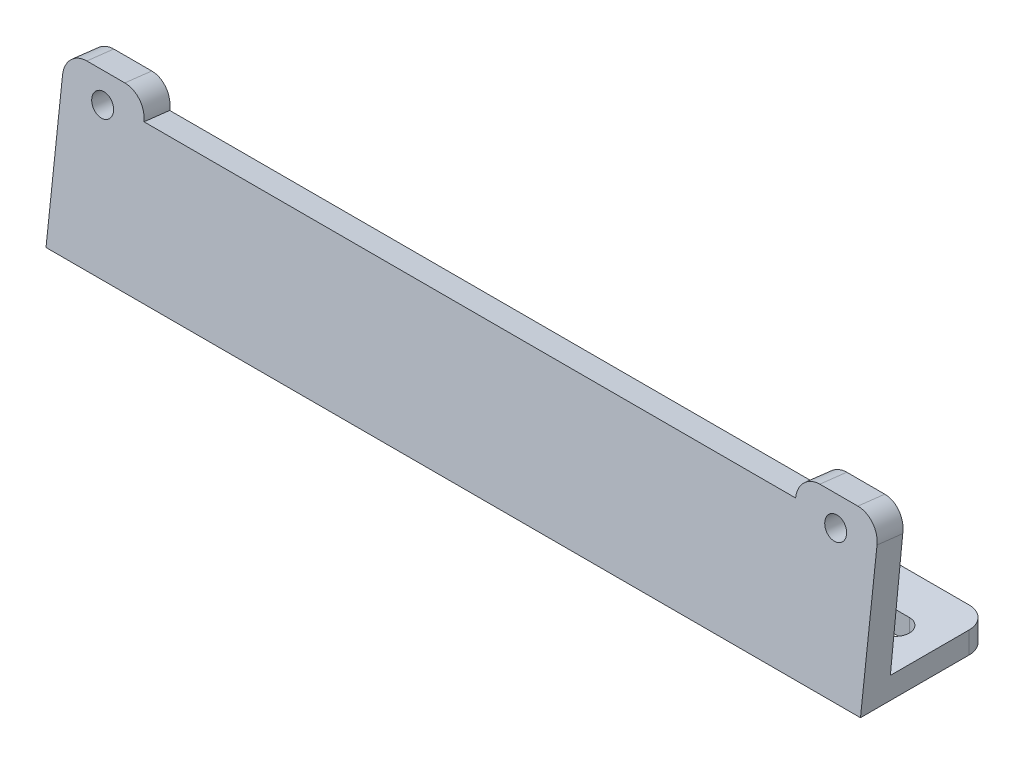
ISO-10303-21;
HEADER;
FILE_DESCRIPTION(('STEP AP214'),'2;1');
FILE_NAME('part.step','',(''),(''),'','','');
FILE_SCHEMA(('AUTOMOTIVE_DESIGN { 1 0 10303 214 1 1 1 1 }'));
ENDSEC;
DATA;
#1=APPLICATION_CONTEXT('core data for automotive mechanical design processes');
#2=APPLICATION_PROTOCOL_DEFINITION('international standard','automotive_design',2000,#1);
#3=PRODUCT_CONTEXT('',#1,'mechanical');
#4=PRODUCT('Part','Part','',(#3));
#5=PRODUCT_RELATED_PRODUCT_CATEGORY('part','',(#4));
#6=PRODUCT_DEFINITION_FORMATION('','',#4);
#7=PRODUCT_DEFINITION_CONTEXT('part definition',#1,'design');
#8=PRODUCT_DEFINITION('design','',#6,#7);
#9=PRODUCT_DEFINITION_SHAPE('','',#8);
#10=(LENGTH_UNIT() NAMED_UNIT(*) SI_UNIT(.MILLI.,.METRE.));
#11=(NAMED_UNIT(*) PLANE_ANGLE_UNIT() SI_UNIT($,.RADIAN.));
#12=(NAMED_UNIT(*) SI_UNIT($,.STERADIAN.) SOLID_ANGLE_UNIT());
#13=UNCERTAINTY_MEASURE_WITH_UNIT(LENGTH_MEASURE(1.E-05),#10,'distance_accuracy_value','');
#14=(GEOMETRIC_REPRESENTATION_CONTEXT(3) GLOBAL_UNCERTAINTY_ASSIGNED_CONTEXT((#13)) GLOBAL_UNIT_ASSIGNED_CONTEXT((#10,
#11,#12)) REPRESENTATION_CONTEXT('',''));
#15=CARTESIAN_POINT('',(0.,0.,0.));
#16=DIRECTION('',(0.,0.,1.));
#17=DIRECTION('',(1.,0.,0.));
#18=AXIS2_PLACEMENT_3D('',#15,#16,#17);
#19=CARTESIAN_POINT('',(-106.175989004611,29.4180052574986,5.51811987731327));
#20=DIRECTION('',(0.,-0.173648177666934,-0.984807753012207));
#21=DIRECTION('',(0.,0.984807753012207,-0.173648177666934));
#22=AXIS2_PLACEMENT_3D('',#19,#20,#21);
#23=PLANE('',#22);
#24=CARTESIAN_POINT('',(-67.5,24.4857099615998,6.3878166148017));
#25=DIRECTION('',(0.,-0.173648177666934,-0.984807753012207));
#26=DIRECTION('',(0.,-0.984807753012207,0.173648177666934));
#27=AXIS2_PLACEMENT_3D('',#24,#25,#26);
#28=ELLIPSE('',#27,2.00836194435498,2.005);
#29=CARTESIAN_POINT('',(-69.2378219126251,25.4721690207795,6.21387726730402));
#30=VERTEX_POINT('',#29);
#31=CARTESIAN_POINT('',(-65.7621780873748,25.4721690207795,6.21387726730402));
#32=VERTEX_POINT('',#31);
#33=EDGE_CURVE('E60',#30,#32,#28,.T.);
#34=ORIENTED_EDGE('',*,*,#33,.F.);
#35=DIRECTION('',(1.,0.,0.));
#36=VECTOR('',#35,1.);
#37=CARTESIAN_POINT('',(-98.210785488107,25.4721690207795,6.21387726730402));
#38=LINE('',#37,#36);
#39=CARTESIAN_POINT('',(-75.,25.4721690207795,6.21387726730402));
#40=VERTEX_POINT('',#39);
#41=EDGE_CURVE('E223',#40,#30,#38,.T.);
#42=ORIENTED_EDGE('',*,*,#41,.F.);
#43=CARTESIAN_POINT('',(-71.,25.4721690207795,6.21387726730402));
#44=DIRECTION('',(0.,-0.173648177666934,-0.984807753012207));
#45=DIRECTION('',(0.,-0.984807753012207,0.173648177666934));
#46=AXIS2_PLACEMENT_3D('',#43,#44,#45);
#47=ELLIPSE('',#46,4.00670712090769,4.);
#48=CARTESIAN_POINT('',(-71.,29.4180052574986,5.51811987731327));
#49=VERTEX_POINT('',#48);
#50=EDGE_CURVE('E412',#40,#49,#47,.T.);
#51=ORIENTED_EDGE('',*,*,#50,.T.);
#52=DIRECTION('',(1.,0.,0.));
#53=VECTOR('',#52,1.);
#54=CARTESIAN_POINT('',(-106.175989004611,29.4180052574986,5.51811987731327));
#55=LINE('',#54,#53);
#56=CARTESIAN_POINT('',(-64.,29.4180052574986,5.51811987731327));
#57=VERTEX_POINT('',#56);
#58=EDGE_CURVE('E296',#49,#57,#55,.T.);
#59=ORIENTED_EDGE('',*,*,#58,.T.);
#60=CARTESIAN_POINT('',(-64.,25.4721690207795,6.21387726730402));
#61=DIRECTION('',(0.,-0.173648177666934,-0.984807753012207));
#62=DIRECTION('',(0.,0.984807753012207,-0.173648177666934));
#63=AXIS2_PLACEMENT_3D('',#60,#61,#62);
#64=ELLIPSE('',#63,4.00670712090769,4.);
#65=CARTESIAN_POINT('',(-60.,25.4721690207795,6.21387726730402));
#66=VERTEX_POINT('',#65);
#67=EDGE_CURVE('E447',#57,#66,#64,.T.);
#68=ORIENTED_EDGE('',*,*,#67,.T.);
#69=EDGE_CURVE('E220',#32,#66,#38,.T.);
#70=ORIENTED_EDGE('',*,*,#69,.F.);
#71=EDGE_LOOP('',(#34,#42,#51,#59,#68,#70));
#72=FACE_BOUND('',#71,.T.);
#73=ADVANCED_FACE('F39',(#72),#23,.T.);
#74=CARTESIAN_POINT('',(-106.175989004611,30.,10.4841325756157));
#75=DIRECTION('',(0.,0.993202539660481,-0.116398948500278));
#76=DIRECTION('',(0.,0.116398948500278,0.993202539660481));
#77=AXIS2_PLACEMENT_3D('',#74,#75,#76);
#78=PLANE('',#77);
#79=DIRECTION('',(1.,0.,0.));
#80=VECTOR('',#79,1.);
#81=CARTESIAN_POINT('',(-106.175989004611,30.,10.4841325756157));
#82=LINE('',#81,#80);
#83=CARTESIAN_POINT('',(-71.,30.,10.4841325756157));
#84=VERTEX_POINT('',#83);
#85=CARTESIAN_POINT('',(-64.,30.,10.4841325756157));
#86=VERTEX_POINT('',#85);
#87=EDGE_CURVE('E286',#84,#86,#82,.T.);
#88=ORIENTED_EDGE('',*,*,#87,.T.);
#89=DIRECTION('',(0.,0.116398948500278,0.993202539660481));
#90=VECTOR('',#89,1.);
#91=CARTESIAN_POINT('',(-64.,29.4180052574986,5.51811987731327));
#92=LINE('',#91,#90);
#93=EDGE_CURVE('E441',#86,#57,#92,.F.);
#94=ORIENTED_EDGE('',*,*,#93,.T.);
#95=ORIENTED_EDGE('',*,*,#58,.F.);
#96=DIRECTION('',(0.,-0.116398948500278,-0.993202539660481));
#97=VECTOR('',#96,1.);
#98=CARTESIAN_POINT('',(-71.,30.,10.4841325756157));
#99=LINE('',#98,#97);
#100=EDGE_CURVE('E419',#49,#84,#99,.F.);
#101=ORIENTED_EDGE('',*,*,#100,.T.);
#102=EDGE_LOOP('',(#88,#94,#95,#101));
#103=FACE_BOUND('',#102,.T.);
#104=ADVANCED_FACE('F531',(#103),#78,.T.);
#105=CARTESIAN_POINT('',(0.,4.,0.));
#106=DIRECTION('',(0.,1.,0.));
#107=DIRECTION('',(0.,0.,1.));
#108=AXIS2_PLACEMENT_3D('',#105,#106,#107);
#109=PLANE('',#108);
#110=DIRECTION('',(1.,0.,0.));
#111=VECTOR('',#110,1.);
#112=CARTESIAN_POINT('',(-98.210785488107,4.,8.4969977665689));
#113=LINE('',#112,#111);
#114=CARTESIAN_POINT('',(-75.,4.,8.4969977665689));
#115=VERTEX_POINT('',#114);
#116=CARTESIAN_POINT('',(75.,4.,8.4969977665689));
#117=VERTEX_POINT('',#116);
#118=EDGE_CURVE('E224',#115,#117,#113,.T.);
#119=ORIENTED_EDGE('',*,*,#118,.T.);
#120=DIRECTION('',(0.,0.,-1.));
#121=VECTOR('',#120,1.);
#122=CARTESIAN_POINT('',(75.,4.,-10.));
#123=LINE('',#122,#121);
#124=CARTESIAN_POINT('',(75.,4.,-6.));
#125=VERTEX_POINT('',#124);
#126=EDGE_CURVE('E386',#117,#125,#123,.T.);
#127=ORIENTED_EDGE('',*,*,#126,.T.);
#128=CARTESIAN_POINT('',(71.,4.,-6.));
#129=DIRECTION('',(0.,1.,0.));
#130=DIRECTION('',(0.,0.,1.));
#131=AXIS2_PLACEMENT_3D('',#128,#129,#130);
#132=CIRCLE('',#131,4.);
#133=CARTESIAN_POINT('',(71.,4.,-10.));
#134=VERTEX_POINT('',#133);
#135=EDGE_CURVE('E474',#125,#134,#132,.T.);
#136=ORIENTED_EDGE('',*,*,#135,.T.);
#137=DIRECTION('',(-1.,0.,0.));
#138=VECTOR('',#137,1.);
#139=CARTESIAN_POINT('',(-75.,4.,-10.));
#140=LINE('',#139,#138);
#141=CARTESIAN_POINT('',(-71.,4.,-10.));
#142=VERTEX_POINT('',#141);
#143=EDGE_CURVE('E389',#134,#142,#140,.T.);
#144=ORIENTED_EDGE('',*,*,#143,.T.);
#145=CARTESIAN_POINT('',(-71.,4.,-6.));
#146=DIRECTION('',(0.,1.,0.));
#147=DIRECTION('',(0.,0.,1.));
#148=AXIS2_PLACEMENT_3D('',#145,#146,#147);
#149=CIRCLE('',#148,4.);
#150=CARTESIAN_POINT('',(-75.,4.,-6.));
#151=VERTEX_POINT('',#150);
#152=EDGE_CURVE('E477',#142,#151,#149,.T.);
#153=ORIENTED_EDGE('',*,*,#152,.T.);
#154=DIRECTION('',(0.,0.,1.));
#155=VECTOR('',#154,1.);
#156=CARTESIAN_POINT('',(-75.,4.,-10.));
#157=LINE('',#156,#155);
#158=EDGE_CURVE('E394',#151,#115,#157,.T.);
#159=ORIENTED_EDGE('',*,*,#158,.T.);
#160=EDGE_LOOP('',(#119,#127,#136,#144,#153,#159));
#161=FACE_BOUND('',#160,.T.);
#162=DIRECTION('',(1.,0.,0.));
#163=VECTOR('',#162,1.);
#164=CARTESIAN_POINT('',(-67.5,4.,2.5));
#165=LINE('',#164,#163);
#166=CARTESIAN_POINT('',(-67.5,4.,2.5));
#167=VERTEX_POINT('',#166);
#168=CARTESIAN_POINT('',(-62.5,4.,2.5));
#169=VERTEX_POINT('',#168);
#170=EDGE_CURVE('E346',#167,#169,#165,.T.);
#171=ORIENTED_EDGE('',*,*,#170,.F.);
#172=CARTESIAN_POINT('',(-67.5,4.,0.));
#173=DIRECTION('',(0.,1.,0.));
#174=DIRECTION('',(0.,0.,1.));
#175=AXIS2_PLACEMENT_3D('',#172,#173,#174);
#176=CIRCLE('',#175,2.5);
#177=CARTESIAN_POINT('',(-67.5,4.,-2.5));
#178=VERTEX_POINT('',#177);
#179=EDGE_CURVE('E343',#178,#167,#176,.T.);
#180=ORIENTED_EDGE('',*,*,#179,.F.);
#181=DIRECTION('',(-1.,0.,0.));
#182=VECTOR('',#181,1.);
#183=CARTESIAN_POINT('',(-67.5,4.,-2.5));
#184=LINE('',#183,#182);
#185=CARTESIAN_POINT('',(-62.5,4.,-2.5));
#186=VERTEX_POINT('',#185);
#187=EDGE_CURVE('E354',#186,#178,#184,.T.);
#188=ORIENTED_EDGE('',*,*,#187,.F.);
#189=CARTESIAN_POINT('',(-62.5,4.,0.));
#190=DIRECTION('',(0.,1.,0.));
#191=DIRECTION('',(0.,0.,1.));
#192=AXIS2_PLACEMENT_3D('',#189,#190,#191);
#193=CIRCLE('',#192,2.5);
#194=EDGE_CURVE('E350',#169,#186,#193,.T.);
#195=ORIENTED_EDGE('',*,*,#194,.F.);
#196=EDGE_LOOP('',(#171,#180,#188,#195));
#197=FACE_BOUND('',#196,.T.);
#198=DIRECTION('',(1.,0.,0.));
#199=VECTOR('',#198,1.);
#200=CARTESIAN_POINT('',(62.5,4.,2.5));
#201=LINE('',#200,#199);
#202=CARTESIAN_POINT('',(62.5,4.,2.5));
#203=VERTEX_POINT('',#202);
#204=CARTESIAN_POINT('',(67.5,4.,2.5));
#205=VERTEX_POINT('',#204);
#206=EDGE_CURVE('E303',#203,#205,#201,.T.);
#207=ORIENTED_EDGE('',*,*,#206,.F.);
#208=CARTESIAN_POINT('',(62.5,4.,0.));
#209=DIRECTION('',(0.,1.,0.));
#210=DIRECTION('',(0.,0.,1.));
#211=AXIS2_PLACEMENT_3D('',#208,#209,#210);
#212=CIRCLE('',#211,2.5);
#213=CARTESIAN_POINT('',(62.5,4.,-2.5));
#214=VERTEX_POINT('',#213);
#215=EDGE_CURVE('E300',#214,#203,#212,.T.);
#216=ORIENTED_EDGE('',*,*,#215,.F.);
#217=DIRECTION('',(-1.,0.,0.));
#218=VECTOR('',#217,1.);
#219=CARTESIAN_POINT('',(62.5,4.,-2.5));
#220=LINE('',#219,#218);
#221=CARTESIAN_POINT('',(67.5,4.,-2.5));
#222=VERTEX_POINT('',#221);
#223=EDGE_CURVE('E311',#222,#214,#220,.T.);
#224=ORIENTED_EDGE('',*,*,#223,.F.);
#225=CARTESIAN_POINT('',(67.5,4.,0.));
#226=DIRECTION('',(0.,1.,0.));
#227=DIRECTION('',(0.,0.,1.));
#228=AXIS2_PLACEMENT_3D('',#225,#226,#227);
#229=CIRCLE('',#228,2.5);
#230=EDGE_CURVE('E307',#205,#222,#229,.T.);
#231=ORIENTED_EDGE('',*,*,#230,.F.);
#232=EDGE_LOOP('',(#207,#216,#224,#231));
#233=FACE_BOUND('',#232,.T.);
#234=ADVANCED_FACE('F489',(#161,#197,#233),#109,.T.);
#235=CARTESIAN_POINT('',(0.,0.,0.));
#236=DIRECTION('',(0.,1.,0.));
#237=DIRECTION('',(0.,0.,1.));
#238=AXIS2_PLACEMENT_3D('',#235,#236,#237);
#239=PLANE('',#238);
#240=CARTESIAN_POINT('',(-67.5,0.,0.));
#241=DIRECTION('',(0.,1.,0.));
#242=DIRECTION('',(0.,0.,1.));
#243=AXIS2_PLACEMENT_3D('',#240,#241,#242);
#244=CIRCLE('',#243,2.5);
#245=CARTESIAN_POINT('',(-67.5,0.,-2.5));
#246=VERTEX_POINT('',#245);
#247=CARTESIAN_POINT('',(-67.5,0.,2.5));
#248=VERTEX_POINT('',#247);
#249=EDGE_CURVE('E342',#246,#248,#244,.T.);
#250=ORIENTED_EDGE('',*,*,#249,.T.);
#251=DIRECTION('',(1.,0.,0.));
#252=VECTOR('',#251,1.);
#253=CARTESIAN_POINT('',(-67.5,0.,2.5));
#254=LINE('',#253,#252);
#255=CARTESIAN_POINT('',(-62.5,0.,2.5));
#256=VERTEX_POINT('',#255);
#257=EDGE_CURVE('E361',#248,#256,#254,.T.);
#258=ORIENTED_EDGE('',*,*,#257,.T.);
#259=CARTESIAN_POINT('',(-62.5,0.,0.));
#260=DIRECTION('',(0.,1.,0.));
#261=DIRECTION('',(0.,0.,1.));
#262=AXIS2_PLACEMENT_3D('',#259,#260,#261);
#263=CIRCLE('',#262,2.5);
#264=CARTESIAN_POINT('',(-62.5,0.,-2.5));
#265=VERTEX_POINT('',#264);
#266=EDGE_CURVE('E365',#256,#265,#263,.T.);
#267=ORIENTED_EDGE('',*,*,#266,.T.);
#268=DIRECTION('',(-1.,0.,0.));
#269=VECTOR('',#268,1.);
#270=CARTESIAN_POINT('',(-67.5,0.,-2.5));
#271=LINE('',#270,#269);
#272=EDGE_CURVE('E347',#265,#246,#271,.T.);
#273=ORIENTED_EDGE('',*,*,#272,.T.);
#274=EDGE_LOOP('',(#250,#258,#267,#273));
#275=FACE_BOUND('',#274,.T.);
#276=DIRECTION('',(0.,0.,1.));
#277=VECTOR('',#276,1.);
#278=CARTESIAN_POINT('',(-75.,0.,-10.));
#279=LINE('',#278,#277);
#280=CARTESIAN_POINT('',(-75.,0.,-6.));
#281=VERTEX_POINT('',#280);
#282=CARTESIAN_POINT('',(-75.,0.,14.));
#283=VERTEX_POINT('',#282);
#284=EDGE_CURVE('E390',#281,#283,#279,.T.);
#285=ORIENTED_EDGE('',*,*,#284,.F.);
#286=CARTESIAN_POINT('',(-71.,0.,-6.));
#287=DIRECTION('',(0.,1.,0.));
#288=DIRECTION('',(0.,0.,1.));
#289=AXIS2_PLACEMENT_3D('',#286,#287,#288);
#290=CIRCLE('',#289,4.);
#291=CARTESIAN_POINT('',(-71.,0.,-10.));
#292=VERTEX_POINT('',#291);
#293=EDGE_CURVE('E464',#281,#292,#290,.F.);
#294=ORIENTED_EDGE('',*,*,#293,.T.);
#295=DIRECTION('',(-1.,0.,0.));
#296=VECTOR('',#295,1.);
#297=CARTESIAN_POINT('',(-75.,0.,-10.));
#298=LINE('',#297,#296);
#299=CARTESIAN_POINT('',(71.,0.,-10.));
#300=VERTEX_POINT('',#299);
#301=EDGE_CURVE('E401',#300,#292,#298,.T.);
#302=ORIENTED_EDGE('',*,*,#301,.F.);
#303=CARTESIAN_POINT('',(71.,0.,-6.));
#304=DIRECTION('',(0.,1.,0.));
#305=DIRECTION('',(0.,0.,1.));
#306=AXIS2_PLACEMENT_3D('',#303,#304,#305);
#307=CIRCLE('',#306,4.);
#308=CARTESIAN_POINT('',(75.,0.,-6.));
#309=VERTEX_POINT('',#308);
#310=EDGE_CURVE('E461',#300,#309,#307,.F.);
#311=ORIENTED_EDGE('',*,*,#310,.T.);
#312=DIRECTION('',(0.,0.,-1.));
#313=VECTOR('',#312,1.);
#314=CARTESIAN_POINT('',(75.,0.,-10.));
#315=LINE('',#314,#313);
#316=CARTESIAN_POINT('',(75.,0.,14.));
#317=VERTEX_POINT('',#316);
#318=EDGE_CURVE('E385',#317,#309,#315,.T.);
#319=ORIENTED_EDGE('',*,*,#318,.F.);
#320=DIRECTION('',(1.,0.,0.));
#321=VECTOR('',#320,1.);
#322=CARTESIAN_POINT('',(-106.175989004611,0.,14.));
#323=LINE('',#322,#321);
#324=EDGE_CURVE('E278',#283,#317,#323,.T.);
#325=ORIENTED_EDGE('',*,*,#324,.F.);
#326=EDGE_LOOP('',(#285,#294,#302,#311,#319,#325));
#327=FACE_BOUND('',#326,.T.);
#328=CARTESIAN_POINT('',(62.5,0.,0.));
#329=DIRECTION('',(0.,1.,0.));
#330=DIRECTION('',(0.,0.,1.));
#331=AXIS2_PLACEMENT_3D('',#328,#329,#330);
#332=CIRCLE('',#331,2.5);
#333=CARTESIAN_POINT('',(62.5,0.,-2.5));
#334=VERTEX_POINT('',#333);
#335=CARTESIAN_POINT('',(62.5,0.,2.5));
#336=VERTEX_POINT('',#335);
#337=EDGE_CURVE('E290',#334,#336,#332,.T.);
#338=ORIENTED_EDGE('',*,*,#337,.T.);
#339=DIRECTION('',(1.,0.,0.));
#340=VECTOR('',#339,1.);
#341=CARTESIAN_POINT('',(62.5,0.,2.5));
#342=LINE('',#341,#340);
#343=CARTESIAN_POINT('',(67.5,0.,2.5));
#344=VERTEX_POINT('',#343);
#345=EDGE_CURVE('E318',#336,#344,#342,.T.);
#346=ORIENTED_EDGE('',*,*,#345,.T.);
#347=CARTESIAN_POINT('',(67.5,0.,0.));
#348=DIRECTION('',(0.,1.,0.));
#349=DIRECTION('',(0.,0.,1.));
#350=AXIS2_PLACEMENT_3D('',#347,#348,#349);
#351=CIRCLE('',#350,2.5);
#352=CARTESIAN_POINT('',(67.5,0.,-2.5));
#353=VERTEX_POINT('',#352);
#354=EDGE_CURVE('E322',#344,#353,#351,.T.);
#355=ORIENTED_EDGE('',*,*,#354,.T.);
#356=DIRECTION('',(-1.,0.,0.));
#357=VECTOR('',#356,1.);
#358=CARTESIAN_POINT('',(62.5,0.,-2.5));
#359=LINE('',#358,#357);
#360=EDGE_CURVE('E304',#353,#334,#359,.T.);
#361=ORIENTED_EDGE('',*,*,#360,.T.);
#362=EDGE_LOOP('',(#338,#346,#355,#361));
#363=FACE_BOUND('',#362,.T.);
#364=ADVANCED_FACE('F500',(#275,#327,#363),#239,.F.);
#365=CARTESIAN_POINT('',(75.,4.,-10.));
#366=DIRECTION('',(-1.,0.,0.));
#367=DIRECTION('',(0.,0.,1.));
#368=AXIS2_PLACEMENT_3D('',#365,#366,#367);
#369=PLANE('',#368);
#370=ORIENTED_EDGE('',*,*,#126,.F.);
#371=DIRECTION('',(0.,0.994394527709063,-0.105733264691252));
#372=VECTOR('',#371,1.);
#373=CARTESIAN_POINT('',(75.,25.4721690207795,6.21387726730402));
#374=LINE('',#373,#372);
#375=CARTESIAN_POINT('',(75.,25.4721690207795,6.21387726730402));
#376=VERTEX_POINT('',#375);
#377=EDGE_CURVE('E246',#117,#376,#374,.T.);
#378=ORIENTED_EDGE('',*,*,#377,.T.);
#379=DIRECTION('',(0.,0.116398948500278,0.993202539660481));
#380=VECTOR('',#379,1.);
#381=CARTESIAN_POINT('',(75.,26.0271898413581,10.9497283696168));
#382=LINE('',#381,#380);
#383=CARTESIAN_POINT('',(75.,26.0271898413581,10.9497283696168));
#384=VERTEX_POINT('',#383);
#385=EDGE_CURVE('E428',#376,#384,#382,.T.);
#386=ORIENTED_EDGE('',*,*,#385,.T.);
#387=DIRECTION('',(0.,-0.993202539660482,0.116398948500269));
#388=VECTOR('',#387,1.);
#389=CARTESIAN_POINT('',(75.,0.,14.));
#390=LINE('',#389,#388);
#391=EDGE_CURVE('E236',#384,#317,#390,.T.);
#392=ORIENTED_EDGE('',*,*,#391,.T.);
#393=ORIENTED_EDGE('',*,*,#318,.T.);
#394=DIRECTION('',(0.,-1.,0.));
#395=VECTOR('',#394,1.);
#396=CARTESIAN_POINT('',(75.,4.,-6.));
#397=LINE('',#396,#395);
#398=EDGE_CURVE('E203',#309,#125,#397,.F.);
#399=ORIENTED_EDGE('',*,*,#398,.T.);
#400=EDGE_LOOP('',(#370,#378,#386,#392,#393,#399));
#401=FACE_BOUND('',#400,.T.);
#402=ADVANCED_FACE('F484',(#401),#369,.F.);
#403=CARTESIAN_POINT('',(-75.,4.,-10.));
#404=DIRECTION('',(0.,0.,1.));
#405=DIRECTION('',(1.,0.,0.));
#406=AXIS2_PLACEMENT_3D('',#403,#404,#405);
#407=PLANE('',#406);
#408=ORIENTED_EDGE('',*,*,#301,.T.);
#409=DIRECTION('',(0.,-1.,0.));
#410=VECTOR('',#409,1.);
#411=CARTESIAN_POINT('',(-71.,4.,-10.));
#412=LINE('',#411,#410);
#413=EDGE_CURVE('E471',#292,#142,#412,.F.);
#414=ORIENTED_EDGE('',*,*,#413,.T.);
#415=ORIENTED_EDGE('',*,*,#143,.F.);
#416=DIRECTION('',(0.,-1.,0.));
#417=VECTOR('',#416,1.);
#418=CARTESIAN_POINT('',(71.,4.,-10.));
#419=LINE('',#418,#417);
#420=EDGE_CURVE('E467',#134,#300,#419,.T.);
#421=ORIENTED_EDGE('',*,*,#420,.T.);
#422=EDGE_LOOP('',(#408,#414,#415,#421));
#423=FACE_BOUND('',#422,.T.);
#424=ADVANCED_FACE('F493',(#423),#407,.F.);
#425=CARTESIAN_POINT('',(-75.,4.,-10.));
#426=DIRECTION('',(1.,0.,0.));
#427=DIRECTION('',(0.,0.,-1.));
#428=AXIS2_PLACEMENT_3D('',#425,#426,#427);
#429=PLANE('',#428);
#430=DIRECTION('',(0.,0.993202539660482,-0.116398948500269));
#431=VECTOR('',#430,1.);
#432=CARTESIAN_POINT('',(-75.,0.,14.));
#433=LINE('',#432,#431);
#434=CARTESIAN_POINT('',(-75.,26.0271898413581,10.9497283696168));
#435=VERTEX_POINT('',#434);
#436=EDGE_CURVE('E281',#283,#435,#433,.T.);
#437=ORIENTED_EDGE('',*,*,#436,.T.);
#438=DIRECTION('',(0.,-0.116398948500278,-0.993202539660481));
#439=VECTOR('',#438,1.);
#440=CARTESIAN_POINT('',(-75.,25.4451950988567,5.98371567131438));
#441=LINE('',#440,#439);
#442=EDGE_CURVE('E397',#435,#40,#441,.T.);
#443=ORIENTED_EDGE('',*,*,#442,.T.);
#444=DIRECTION('',(0.,-0.994394527709063,0.105733264691252));
#445=VECTOR('',#444,1.);
#446=CARTESIAN_POINT('',(-75.,25.4721690207795,6.21387726730402));
#447=LINE('',#446,#445);
#448=EDGE_CURVE('E232',#40,#115,#447,.T.);
#449=ORIENTED_EDGE('',*,*,#448,.T.);
#450=ORIENTED_EDGE('',*,*,#158,.F.);
#451=DIRECTION('',(0.,-1.,0.));
#452=VECTOR('',#451,1.);
#453=CARTESIAN_POINT('',(-75.,4.,-6.));
#454=LINE('',#453,#452);
#455=EDGE_CURVE('E457',#151,#281,#454,.T.);
#456=ORIENTED_EDGE('',*,*,#455,.T.);
#457=ORIENTED_EDGE('',*,*,#284,.T.);
#458=EDGE_LOOP('',(#437,#443,#449,#450,#456,#457));
#459=FACE_BOUND('',#458,.T.);
#460=ADVANCED_FACE('F499',(#459),#429,.F.);
#461=CARTESIAN_POINT('',(-67.5,4.,0.));
#462=DIRECTION('',(0.,-1.,0.));
#463=DIRECTION('',(0.,0.,-1.));
#464=AXIS2_PLACEMENT_3D('',#461,#462,#463);
#465=CYLINDRICAL_SURFACE('',#464,2.5);
#466=ORIENTED_EDGE('',*,*,#249,.F.);
#467=DIRECTION('',(0.,-1.,0.));
#468=VECTOR('',#467,1.);
#469=CARTESIAN_POINT('',(-67.5,4.,-2.5));
#470=LINE('',#469,#468);
#471=EDGE_CURVE('E357',#178,#246,#470,.T.);
#472=ORIENTED_EDGE('',*,*,#471,.F.);
#473=ORIENTED_EDGE('',*,*,#179,.T.);
#474=DIRECTION('',(0.,-1.,0.));
#475=VECTOR('',#474,1.);
#476=CARTESIAN_POINT('',(-67.5,4.,2.5));
#477=LINE('',#476,#475);
#478=EDGE_CURVE('E381',#167,#248,#477,.T.);
#479=ORIENTED_EDGE('',*,*,#478,.T.);
#480=EDGE_LOOP('',(#466,#472,#473,#479));
#481=FACE_BOUND('',#480,.T.);
#482=ADVANCED_FACE('F628',(#481),#465,.F.);
#483=CARTESIAN_POINT('',(-67.5,4.,2.5));
#484=DIRECTION('',(0.,0.,-1.));
#485=DIRECTION('',(-1.,0.,0.));
#486=AXIS2_PLACEMENT_3D('',#483,#484,#485);
#487=PLANE('',#486);
#488=ORIENTED_EDGE('',*,*,#257,.F.);
#489=ORIENTED_EDGE('',*,*,#478,.F.);
#490=ORIENTED_EDGE('',*,*,#170,.T.);
#491=DIRECTION('',(0.,-1.,0.));
#492=VECTOR('',#491,1.);
#493=CARTESIAN_POINT('',(-62.5,4.,2.5));
#494=LINE('',#493,#492);
#495=EDGE_CURVE('E378',#169,#256,#494,.T.);
#496=ORIENTED_EDGE('',*,*,#495,.T.);
#497=EDGE_LOOP('',(#488,#489,#490,#496));
#498=FACE_BOUND('',#497,.T.);
#499=ADVANCED_FACE('F749',(#498),#487,.T.);
#500=CARTESIAN_POINT('',(-62.5,4.,0.));
#501=DIRECTION('',(0.,-1.,0.));
#502=DIRECTION('',(0.,0.,-1.));
#503=AXIS2_PLACEMENT_3D('',#500,#501,#502);
#504=CYLINDRICAL_SURFACE('',#503,2.5);
#505=ORIENTED_EDGE('',*,*,#266,.F.);
#506=ORIENTED_EDGE('',*,*,#495,.F.);
#507=ORIENTED_EDGE('',*,*,#194,.T.);
#508=DIRECTION('',(0.,-1.,0.));
#509=VECTOR('',#508,1.);
#510=CARTESIAN_POINT('',(-62.5,4.,-2.5));
#511=LINE('',#510,#509);
#512=EDGE_CURVE('E375',#186,#265,#511,.T.);
#513=ORIENTED_EDGE('',*,*,#512,.T.);
#514=EDGE_LOOP('',(#505,#506,#507,#513));
#515=FACE_BOUND('',#514,.T.);
#516=ADVANCED_FACE('F739',(#515),#504,.F.);
#517=CARTESIAN_POINT('',(-67.5,4.,-2.5));
#518=DIRECTION('',(0.,0.,1.));
#519=DIRECTION('',(1.,0.,0.));
#520=AXIS2_PLACEMENT_3D('',#517,#518,#519);
#521=PLANE('',#520);
#522=ORIENTED_EDGE('',*,*,#272,.F.);
#523=ORIENTED_EDGE('',*,*,#512,.F.);
#524=ORIENTED_EDGE('',*,*,#187,.T.);
#525=ORIENTED_EDGE('',*,*,#471,.T.);
#526=EDGE_LOOP('',(#522,#523,#524,#525));
#527=FACE_BOUND('',#526,.T.);
#528=ADVANCED_FACE('F730',(#527),#521,.T.);
#529=CARTESIAN_POINT('',(62.5,4.,0.));
#530=DIRECTION('',(0.,-1.,0.));
#531=DIRECTION('',(0.,0.,-1.));
#532=AXIS2_PLACEMENT_3D('',#529,#530,#531);
#533=CYLINDRICAL_SURFACE('',#532,2.5);
#534=ORIENTED_EDGE('',*,*,#337,.F.);
#535=DIRECTION('',(0.,-1.,0.));
#536=VECTOR('',#535,1.);
#537=CARTESIAN_POINT('',(62.5,4.,-2.5));
#538=LINE('',#537,#536);
#539=EDGE_CURVE('E314',#214,#334,#538,.T.);
#540=ORIENTED_EDGE('',*,*,#539,.F.);
#541=ORIENTED_EDGE('',*,*,#215,.T.);
#542=DIRECTION('',(0.,-1.,0.));
#543=VECTOR('',#542,1.);
#544=CARTESIAN_POINT('',(62.5,4.,2.5));
#545=LINE('',#544,#543);
#546=EDGE_CURVE('E338',#203,#336,#545,.T.);
#547=ORIENTED_EDGE('',*,*,#546,.T.);
#548=EDGE_LOOP('',(#534,#540,#541,#547));
#549=FACE_BOUND('',#548,.T.);
#550=ADVANCED_FACE('F508',(#549),#533,.F.);
#551=CARTESIAN_POINT('',(62.5,4.,2.5));
#552=DIRECTION('',(0.,0.,-1.));
#553=DIRECTION('',(-1.,0.,0.));
#554=AXIS2_PLACEMENT_3D('',#551,#552,#553);
#555=PLANE('',#554);
#556=ORIENTED_EDGE('',*,*,#345,.F.);
#557=ORIENTED_EDGE('',*,*,#546,.F.);
#558=ORIENTED_EDGE('',*,*,#206,.T.);
#559=DIRECTION('',(0.,-1.,0.));
#560=VECTOR('',#559,1.);
#561=CARTESIAN_POINT('',(67.5,4.,2.5));
#562=LINE('',#561,#560);
#563=EDGE_CURVE('E335',#205,#344,#562,.T.);
#564=ORIENTED_EDGE('',*,*,#563,.T.);
#565=EDGE_LOOP('',(#556,#557,#558,#564));
#566=FACE_BOUND('',#565,.T.);
#567=ADVANCED_FACE('F517',(#566),#555,.T.);
#568=CARTESIAN_POINT('',(67.5,4.,0.));
#569=DIRECTION('',(0.,-1.,0.));
#570=DIRECTION('',(0.,0.,-1.));
#571=AXIS2_PLACEMENT_3D('',#568,#569,#570);
#572=CYLINDRICAL_SURFACE('',#571,2.5);
#573=ORIENTED_EDGE('',*,*,#354,.F.);
#574=ORIENTED_EDGE('',*,*,#563,.F.);
#575=ORIENTED_EDGE('',*,*,#230,.T.);
#576=DIRECTION('',(0.,-1.,0.));
#577=VECTOR('',#576,1.);
#578=CARTESIAN_POINT('',(67.5,4.,-2.5));
#579=LINE('',#578,#577);
#580=EDGE_CURVE('E332',#222,#353,#579,.T.);
#581=ORIENTED_EDGE('',*,*,#580,.T.);
#582=EDGE_LOOP('',(#573,#574,#575,#581));
#583=FACE_BOUND('',#582,.T.);
#584=ADVANCED_FACE('F521',(#583),#572,.F.);
#585=CARTESIAN_POINT('',(62.5,4.,-2.5));
#586=DIRECTION('',(0.,0.,1.));
#587=DIRECTION('',(1.,0.,0.));
#588=AXIS2_PLACEMENT_3D('',#585,#586,#587);
#589=PLANE('',#588);
#590=ORIENTED_EDGE('',*,*,#360,.F.);
#591=ORIENTED_EDGE('',*,*,#580,.F.);
#592=ORIENTED_EDGE('',*,*,#223,.T.);
#593=ORIENTED_EDGE('',*,*,#539,.T.);
#594=EDGE_LOOP('',(#590,#591,#592,#593));
#595=FACE_BOUND('',#594,.T.);
#596=ADVANCED_FACE('F271',(#595),#589,.T.);
#597=CARTESIAN_POINT('',(-106.175989004611,0.,14.));
#598=DIRECTION('',(0.,0.116398948500269,0.993202539660482));
#599=DIRECTION('',(0.,-0.993202539660482,0.116398948500269));
#600=AXIS2_PLACEMENT_3D('',#597,#598,#599);
#601=PLANE('',#600);
#602=CARTESIAN_POINT('',(-67.5,25.0339873016976,11.066127318117));
#603=DIRECTION('',(0.,0.116398948500269,0.993202539660482));
#604=DIRECTION('',(0.,-0.993202539660482,0.116398948500269));
#605=AXIS2_PLACEMENT_3D('',#602,#603,#604);
#606=CIRCLE('',#605,2.005);
#607=CARTESIAN_POINT('',(-67.5,23.0426162096783,11.2995072098601));
#608=VERTEX_POINT('',#607);
#609=EDGE_CURVE('E212',#608,#608,#606,.T.);
#610=ORIENTED_EDGE('',*,*,#609,.F.);
#611=EDGE_LOOP('',(#610));
#612=FACE_BOUND('',#611,.T.);
#613=CARTESIAN_POINT('',(67.5,25.0339873016976,11.066127318117));
#614=DIRECTION('',(0.,0.116398948500269,0.993202539660482));
#615=DIRECTION('',(0.,-0.993202539660482,0.116398948500269));
#616=AXIS2_PLACEMENT_3D('',#613,#614,#615);
#617=CIRCLE('',#616,2.005);
#618=CARTESIAN_POINT('',(67.5,23.0426162096783,11.2995072098601));
#619=VERTEX_POINT('',#618);
#620=EDGE_CURVE('E261',#619,#619,#617,.T.);
#621=ORIENTED_EDGE('',*,*,#620,.F.);
#622=EDGE_LOOP('',(#621));
#623=FACE_BOUND('',#622,.T.);
#624=ORIENTED_EDGE('',*,*,#324,.T.);
#625=ORIENTED_EDGE('',*,*,#391,.F.);
#626=CARTESIAN_POINT('',(71.,26.0271898413581,10.9497283696168));
#627=DIRECTION('',(0.,0.116398948500269,0.993202539660482));
#628=DIRECTION('',(0.,-0.993202539660482,0.116398948500269));
#629=AXIS2_PLACEMENT_3D('',#626,#627,#628);
#630=CIRCLE('',#629,4.);
#631=CARTESIAN_POINT('',(71.,30.,10.4841325756157));
#632=VERTEX_POINT('',#631);
#633=EDGE_CURVE('E422',#384,#632,#630,.T.);
#634=ORIENTED_EDGE('',*,*,#633,.T.);
#635=CARTESIAN_POINT('',(64.,30.,10.4841325756157));
#636=VERTEX_POINT('',#635);
#637=EDGE_CURVE('E293',#636,#632,#82,.T.);
#638=ORIENTED_EDGE('',*,*,#637,.F.);
#639=CARTESIAN_POINT('',(64.,26.0271898413581,10.9497283696168));
#640=DIRECTION('',(0.,0.116398948500269,0.993202539660482));
#641=DIRECTION('',(0.,-0.993202539660482,0.116398948500269));
#642=AXIS2_PLACEMENT_3D('',#639,#640,#641);
#643=CIRCLE('',#642,4.);
#644=CARTESIAN_POINT('',(60.,26.0271898413581,10.9497283696168));
#645=VERTEX_POINT('',#644);
#646=EDGE_CURVE('E435',#636,#645,#643,.T.);
#647=ORIENTED_EDGE('',*,*,#646,.T.);
#648=DIRECTION('',(1.,0.,0.));
#649=VECTOR('',#648,1.);
#650=CARTESIAN_POINT('',(-98.210785488107,26.027189841358,10.9497283696168));
#651=LINE('',#650,#649);
#652=CARTESIAN_POINT('',(-60.,26.0271898413581,10.9497283696168));
#653=VERTEX_POINT('',#652);
#654=EDGE_CURVE('E249',#653,#645,#651,.T.);
#655=ORIENTED_EDGE('',*,*,#654,.F.);
#656=CARTESIAN_POINT('',(-64.,26.0271898413581,10.9497283696168));
#657=DIRECTION('',(0.,0.116398948500269,0.993202539660482));
#658=DIRECTION('',(0.,-0.993202539660482,0.116398948500269));
#659=AXIS2_PLACEMENT_3D('',#656,#657,#658);
#660=CIRCLE('',#659,4.);
#661=EDGE_CURVE('E438',#653,#86,#660,.T.);
#662=ORIENTED_EDGE('',*,*,#661,.T.);
#663=ORIENTED_EDGE('',*,*,#87,.F.);
#664=CARTESIAN_POINT('',(-71.,26.0271898413581,10.9497283696168));
#665=DIRECTION('',(0.,0.116398948500269,0.993202539660482));
#666=DIRECTION('',(0.,-0.993202539660482,0.116398948500269));
#667=AXIS2_PLACEMENT_3D('',#664,#665,#666);
#668=CIRCLE('',#667,4.);
#669=EDGE_CURVE('E425',#84,#435,#668,.T.);
#670=ORIENTED_EDGE('',*,*,#669,.T.);
#671=ORIENTED_EDGE('',*,*,#436,.F.);
#672=EDGE_LOOP('',(#624,#625,#634,#638,#647,#655,#662,#663,#670,#671));
#673=FACE_BOUND('',#672,.T.);
#674=ADVANCED_FACE('F267',(#612,#623,#673),#601,.T.);
#675=CARTESIAN_POINT('',(64.,29.4180052574986,5.51811987731327));
#676=VERTEX_POINT('',#675);
#677=CARTESIAN_POINT('',(71.,29.4180052574986,5.51811987731327));
#678=VERTEX_POINT('',#677);
#679=EDGE_CURVE('E243',#676,#678,#55,.T.);
#680=ORIENTED_EDGE('',*,*,#679,.F.);
#681=DIRECTION('',(0.,0.116398948500278,0.993202539660481));
#682=VECTOR('',#681,1.);
#683=CARTESIAN_POINT('',(64.,30.,10.4841325756157));
#684=LINE('',#683,#682);
#685=EDGE_CURVE('E450',#676,#636,#684,.T.);
#686=ORIENTED_EDGE('',*,*,#685,.T.);
#687=ORIENTED_EDGE('',*,*,#637,.T.);
#688=DIRECTION('',(0.,0.116398948500278,0.993202539660481));
#689=VECTOR('',#688,1.);
#690=CARTESIAN_POINT('',(71.,29.4180052574986,5.51811987731327));
#691=LINE('',#690,#689);
#692=EDGE_CURVE('E415',#632,#678,#691,.F.);
#693=ORIENTED_EDGE('',*,*,#692,.T.);
#694=EDGE_LOOP('',(#680,#686,#687,#693));
#695=FACE_BOUND('',#694,.T.);
#696=ADVANCED_FACE('F270',(#695),#78,.T.);
#697=CARTESIAN_POINT('',(67.5,24.4857099615998,6.3878166148017));
#698=DIRECTION('',(0.,-0.173648177666934,-0.984807753012207));
#699=DIRECTION('',(0.,-0.984807753012207,0.173648177666934));
#700=AXIS2_PLACEMENT_3D('',#697,#698,#699);
#701=ELLIPSE('',#700,2.00836194435498,2.005);
#702=CARTESIAN_POINT('',(65.7621780873749,25.4721690207795,6.21387726730402));
#703=VERTEX_POINT('',#702);
#704=CARTESIAN_POINT('',(69.2378219126252,25.4721690207795,6.21387726730402));
#705=VERTEX_POINT('',#704);
#706=EDGE_CURVE('E54',#703,#705,#701,.T.);
#707=ORIENTED_EDGE('',*,*,#706,.F.);
#708=CARTESIAN_POINT('',(60.,25.4721690207795,6.21387726730402));
#709=VERTEX_POINT('',#708);
#710=EDGE_CURVE('E207',#709,#703,#38,.T.);
#711=ORIENTED_EDGE('',*,*,#710,.F.);
#712=CARTESIAN_POINT('',(64.,25.4721690207795,6.21387726730402));
#713=DIRECTION('',(0.,-0.173648177666934,-0.984807753012207));
#714=DIRECTION('',(0.,0.984807753012207,-0.173648177666934));
#715=AXIS2_PLACEMENT_3D('',#712,#713,#714);
#716=ELLIPSE('',#715,4.00670712090769,4.);
#717=EDGE_CURVE('E444',#709,#676,#716,.T.);
#718=ORIENTED_EDGE('',*,*,#717,.T.);
#719=ORIENTED_EDGE('',*,*,#679,.T.);
#720=CARTESIAN_POINT('',(71.,25.4721690207795,6.21387726730402));
#721=DIRECTION('',(0.,-0.173648177666934,-0.984807753012207));
#722=DIRECTION('',(0.,0.984807753012207,-0.173648177666934));
#723=AXIS2_PLACEMENT_3D('',#720,#721,#722);
#724=ELLIPSE('',#723,4.00670712090769,4.);
#725=EDGE_CURVE('E409',#678,#376,#724,.T.);
#726=ORIENTED_EDGE('',*,*,#725,.T.);
#727=EDGE_CURVE('E210',#705,#376,#38,.T.);
#728=ORIENTED_EDGE('',*,*,#727,.F.);
#729=EDGE_LOOP('',(#707,#711,#718,#719,#726,#728));
#730=FACE_BOUND('',#729,.T.);
#731=ADVANCED_FACE('F206',(#730),#23,.T.);
#732=CARTESIAN_POINT('',(-71.,23.3067991518631,-12.2626715402391));
#733=DIRECTION('',(0.,0.116398948500278,0.993202539660481));
#734=DIRECTION('',(0.,-0.993202539660481,0.116398948500278));
#735=AXIS2_PLACEMENT_3D('',#732,#733,#734);
#736=CYLINDRICAL_SURFACE('',#735,4.);
#737=ORIENTED_EDGE('',*,*,#669,.F.);
#738=ORIENTED_EDGE('',*,*,#100,.F.);
#739=ORIENTED_EDGE('',*,*,#50,.F.);
#740=ORIENTED_EDGE('',*,*,#442,.F.);
#741=EDGE_LOOP('',(#737,#738,#739,#740));
#742=FACE_BOUND('',#741,.T.);
#743=ADVANCED_FACE('F540',(#742),#736,.T.);
#744=CARTESIAN_POINT('',(71.,23.3067991518631,-12.2626715402391));
#745=DIRECTION('',(0.,-0.116398948500278,-0.993202539660481));
#746=DIRECTION('',(0.,0.993202539660481,-0.116398948500278));
#747=AXIS2_PLACEMENT_3D('',#744,#745,#746);
#748=CYLINDRICAL_SURFACE('',#747,4.);
#749=ORIENTED_EDGE('',*,*,#725,.F.);
#750=ORIENTED_EDGE('',*,*,#692,.F.);
#751=ORIENTED_EDGE('',*,*,#633,.F.);
#752=ORIENTED_EDGE('',*,*,#385,.F.);
#753=EDGE_LOOP('',(#749,#750,#751,#752));
#754=FACE_BOUND('',#753,.T.);
#755=ADVANCED_FACE('F545',(#754),#748,.T.);
#756=CARTESIAN_POINT('',(-64.,24.8632003563553,1.01770297301199));
#757=DIRECTION('',(0.,-0.116398948500278,-0.993202539660481));
#758=DIRECTION('',(0.,0.993202539660481,-0.116398948500278));
#759=AXIS2_PLACEMENT_3D('',#756,#757,#758);
#760=CYLINDRICAL_SURFACE('',#759,4.);
#761=ORIENTED_EDGE('',*,*,#67,.F.);
#762=ORIENTED_EDGE('',*,*,#93,.F.);
#763=ORIENTED_EDGE('',*,*,#661,.F.);
#764=DIRECTION('',(0.,0.116398948500278,0.993202539660481));
#765=VECTOR('',#764,1.);
#766=CARTESIAN_POINT('',(-60.,26.0271898413581,10.9497283696168));
#767=LINE('',#766,#765);
#768=EDGE_CURVE('E431',#66,#653,#767,.T.);
#769=ORIENTED_EDGE('',*,*,#768,.F.);
#770=EDGE_LOOP('',(#761,#762,#763,#769));
#771=FACE_BOUND('',#770,.T.);
#772=ADVANCED_FACE('F598',(#771),#760,.T.);
#773=CARTESIAN_POINT('',(64.,26.0271898413581,10.9497283696168));
#774=DIRECTION('',(0.,-0.116398948500278,-0.993202539660481));
#775=DIRECTION('',(0.,0.993202539660481,-0.116398948500278));
#776=AXIS2_PLACEMENT_3D('',#773,#774,#775);
#777=CYLINDRICAL_SURFACE('',#776,4.);
#778=ORIENTED_EDGE('',*,*,#717,.F.);
#779=DIRECTION('',(0.,0.116398948500278,0.993202539660481));
#780=VECTOR('',#779,1.);
#781=CARTESIAN_POINT('',(60.,25.4451950988567,5.98371567131438));
#782=LINE('',#781,#780);
#783=EDGE_CURVE('E454',#645,#709,#782,.F.);
#784=ORIENTED_EDGE('',*,*,#783,.F.);
#785=ORIENTED_EDGE('',*,*,#646,.F.);
#786=ORIENTED_EDGE('',*,*,#685,.F.);
#787=EDGE_LOOP('',(#778,#784,#785,#786));
#788=FACE_BOUND('',#787,.T.);
#789=ADVANCED_FACE('F592',(#788),#777,.T.);
#790=CARTESIAN_POINT('',(-71.,4.,-6.));
#791=DIRECTION('',(0.,-1.,0.));
#792=DIRECTION('',(0.,0.,-1.));
#793=AXIS2_PLACEMENT_3D('',#790,#791,#792);
#794=CYLINDRICAL_SURFACE('',#793,4.);
#795=ORIENTED_EDGE('',*,*,#152,.F.);
#796=ORIENTED_EDGE('',*,*,#413,.F.);
#797=ORIENTED_EDGE('',*,*,#293,.F.);
#798=ORIENTED_EDGE('',*,*,#455,.F.);
#799=EDGE_LOOP('',(#795,#796,#797,#798));
#800=FACE_BOUND('',#799,.T.);
#801=ADVANCED_FACE('F497',(#800),#794,.T.);
#802=CARTESIAN_POINT('',(71.,4.,-6.));
#803=DIRECTION('',(0.,-1.,0.));
#804=DIRECTION('',(0.,0.,-1.));
#805=AXIS2_PLACEMENT_3D('',#802,#803,#804);
#806=CYLINDRICAL_SURFACE('',#805,4.);
#807=ORIENTED_EDGE('',*,*,#135,.F.);
#808=ORIENTED_EDGE('',*,*,#398,.F.);
#809=ORIENTED_EDGE('',*,*,#310,.F.);
#810=ORIENTED_EDGE('',*,*,#420,.F.);
#811=EDGE_LOOP('',(#807,#808,#809,#810));
#812=FACE_BOUND('',#811,.T.);
#813=ADVANCED_FACE('F41',(#812),#806,.T.);
#814=CARTESIAN_POINT('',(-98.210785488107,26.027189841358,10.9497283696168));
#815=DIRECTION('',(0.,0.993202539660482,-0.116398948500268));
#816=DIRECTION('',(0.,0.116398948500268,0.993202539660482));
#817=AXIS2_PLACEMENT_3D('',#814,#815,#816);
#818=PLANE('',#817);
#819=EDGE_CURVE('E217',#66,#709,#38,.T.);
#820=ORIENTED_EDGE('',*,*,#819,.F.);
#821=ORIENTED_EDGE('',*,*,#768,.T.);
#822=ORIENTED_EDGE('',*,*,#654,.T.);
#823=ORIENTED_EDGE('',*,*,#783,.T.);
#824=EDGE_LOOP('',(#820,#821,#822,#823));
#825=FACE_BOUND('',#824,.T.);
#826=ADVANCED_FACE('F553',(#825),#818,.T.);
#827=CARTESIAN_POINT('',(-98.210785488107,25.4721690207795,6.21387726730402));
#828=DIRECTION('',(0.,-0.105733264691252,-0.994394527709063));
#829=DIRECTION('',(0.,0.994394527709063,-0.105733264691252));
#830=AXIS2_PLACEMENT_3D('',#827,#828,#829);
#831=PLANE('',#830);
#832=CARTESIAN_POINT('',(-67.5,24.4777172237617,6.31961662140025));
#833=DIRECTION('',(0.,-0.105733264691252,-0.994394527709063));
#834=DIRECTION('',(0.,0.994394527709063,-0.105733264691252));
#835=AXIS2_PLACEMENT_3D('',#832,#833,#834);
#836=ELLIPSE('',#835,2.00511547224065,2.005);
#837=EDGE_CURVE('E11',#32,#30,#836,.T.);
#838=ORIENTED_EDGE('',*,*,#837,.F.);
#839=ORIENTED_EDGE('',*,*,#69,.T.);
#840=ORIENTED_EDGE('',*,*,#819,.T.);
#841=ORIENTED_EDGE('',*,*,#710,.T.);
#842=CARTESIAN_POINT('',(67.5,24.4777172237617,6.31961662140025));
#843=DIRECTION('',(0.,-0.105733264691252,-0.994394527709063));
#844=DIRECTION('',(0.,0.994394527709063,-0.105733264691252));
#845=AXIS2_PLACEMENT_3D('',#842,#843,#844);
#846=ELLIPSE('',#845,2.00511547224065,2.005);
#847=EDGE_CURVE('E48',#705,#703,#846,.T.);
#848=ORIENTED_EDGE('',*,*,#847,.F.);
#849=ORIENTED_EDGE('',*,*,#727,.T.);
#850=ORIENTED_EDGE('',*,*,#377,.F.);
#851=ORIENTED_EDGE('',*,*,#118,.F.);
#852=ORIENTED_EDGE('',*,*,#448,.F.);
#853=ORIENTED_EDGE('',*,*,#41,.T.);
#854=EDGE_LOOP('',(#838,#839,#840,#841,#848,#849,#850,#851,#852,#853));
#855=FACE_BOUND('',#854,.T.);
#856=ADVANCED_FACE('F215',(#855),#831,.T.);
#857=CARTESIAN_POINT('',(67.5,23.8699978166949,1.13410192151221));
#858=DIRECTION('',(0.,0.116398948500269,0.993202539660482));
#859=DIRECTION('',(0.,-0.993202539660482,0.116398948500269));
#860=AXIS2_PLACEMENT_3D('',#857,#858,#859);
#861=CYLINDRICAL_SURFACE('',#860,2.005);
#862=ORIENTED_EDGE('',*,*,#706,.T.);
#863=ORIENTED_EDGE('',*,*,#847,.T.);
#864=EDGE_LOOP('',(#862,#863));
#865=FACE_BOUND('',#864,.T.);
#866=ORIENTED_EDGE('',*,*,#620,.T.);
#867=EDGE_LOOP('',(#866));
#868=FACE_BOUND('',#867,.T.);
#869=ADVANCED_FACE('F197',(#865,#868),#861,.F.);
#870=CARTESIAN_POINT('',(-67.5,23.8699978166949,1.13410192151221));
#871=DIRECTION('',(0.,0.116398948500269,0.993202539660482));
#872=DIRECTION('',(0.,-0.993202539660482,0.116398948500269));
#873=AXIS2_PLACEMENT_3D('',#870,#871,#872);
#874=CYLINDRICAL_SURFACE('',#873,2.005);
#875=ORIENTED_EDGE('',*,*,#33,.T.);
#876=ORIENTED_EDGE('',*,*,#837,.T.);
#877=EDGE_LOOP('',(#875,#876));
#878=FACE_BOUND('',#877,.T.);
#879=ORIENTED_EDGE('',*,*,#609,.T.);
#880=EDGE_LOOP('',(#879));
#881=FACE_BOUND('',#880,.T.);
#882=ADVANCED_FACE('F561',(#878,#881),#874,.F.);
#883=CLOSED_SHELL('',(#73,#104,#234,#364,#402,#424,#460,#482,#499,#516,#528,#550,#567,#584,#596,
#674,#696,#731,#743,#755,#772,#789,#801,#813,#826,#856,#869,#882));
#884=MANIFOLD_SOLID_BREP('B2',#883);
#885=ADVANCED_BREP_SHAPE_REPRESENTATION('',(#18,#884),#14);
#886=SHAPE_DEFINITION_REPRESENTATION(#9,#885);
ENDSEC;
END-ISO-10303-21;
